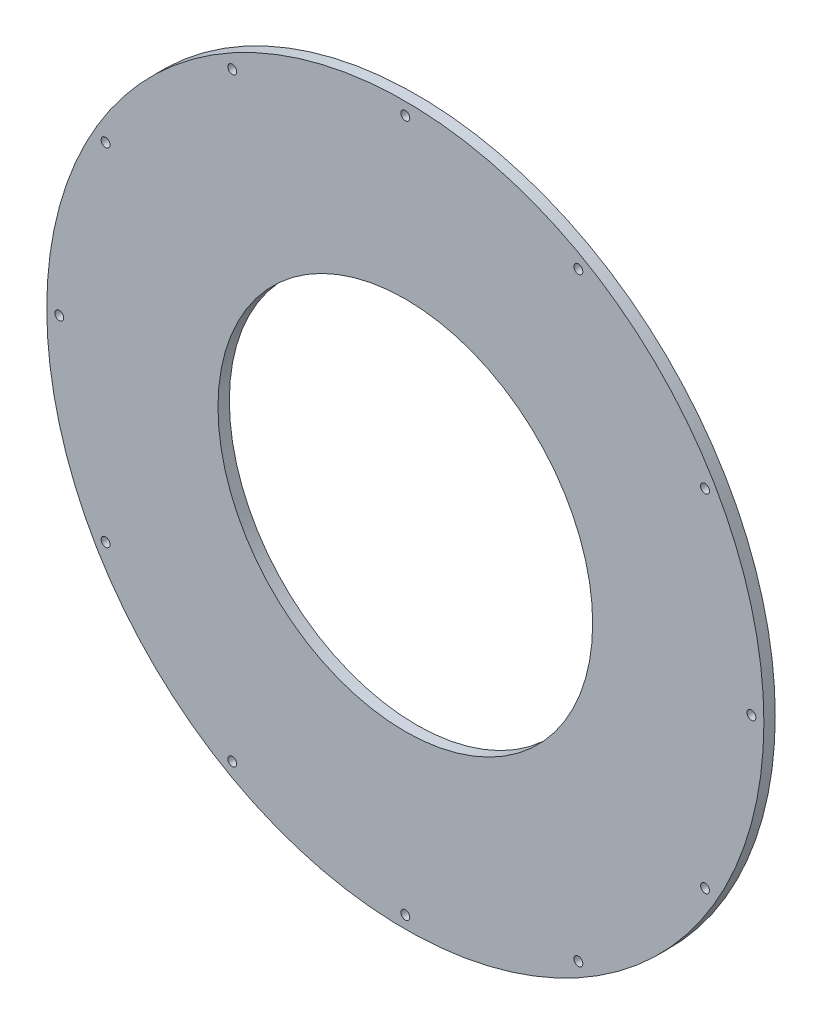
ISO-10303-21;
HEADER;
FILE_DESCRIPTION(('STEP AP214'),'2;1');
FILE_NAME('part.step','',(''),(''),'','','');
FILE_SCHEMA(('AUTOMOTIVE_DESIGN { 1 0 10303 214 1 1 1 1 }'));
ENDSEC;
DATA;
#1=APPLICATION_CONTEXT('core data for automotive mechanical design processes');
#2=APPLICATION_PROTOCOL_DEFINITION('international standard','automotive_design',2000,#1);
#3=PRODUCT_CONTEXT('',#1,'mechanical');
#4=PRODUCT('Part','Part','',(#3));
#5=PRODUCT_RELATED_PRODUCT_CATEGORY('part','',(#4));
#6=PRODUCT_DEFINITION_FORMATION('','',#4);
#7=PRODUCT_DEFINITION_CONTEXT('part definition',#1,'design');
#8=PRODUCT_DEFINITION('design','',#6,#7);
#9=PRODUCT_DEFINITION_SHAPE('','',#8);
#10=(LENGTH_UNIT() NAMED_UNIT(*) SI_UNIT(.MILLI.,.METRE.));
#11=(NAMED_UNIT(*) PLANE_ANGLE_UNIT() SI_UNIT($,.RADIAN.));
#12=(NAMED_UNIT(*) SI_UNIT($,.STERADIAN.) SOLID_ANGLE_UNIT());
#13=UNCERTAINTY_MEASURE_WITH_UNIT(LENGTH_MEASURE(1.E-05),#10,'distance_accuracy_value','');
#14=(GEOMETRIC_REPRESENTATION_CONTEXT(3) GLOBAL_UNCERTAINTY_ASSIGNED_CONTEXT((#13)) GLOBAL_UNIT_ASSIGNED_CONTEXT((#10,
#11,#12)) REPRESENTATION_CONTEXT('',''));
#15=CARTESIAN_POINT('',(0.,0.,0.));
#16=DIRECTION('',(0.,0.,1.));
#17=DIRECTION('',(1.,0.,0.));
#18=AXIS2_PLACEMENT_3D('',#15,#16,#17);
#19=CARTESIAN_POINT('',(0.,0.,6.35));
#20=DIRECTION('',(0.,0.,1.));
#21=DIRECTION('',(1.,0.,0.));
#22=AXIS2_PLACEMENT_3D('',#19,#20,#21);
#23=PLANE('',#22);
#24=CARTESIAN_POINT('',(-96.774,167.617484851671,6.35));
#25=DIRECTION('',(0.,0.,1.));
#26=DIRECTION('',(1.,0.,0.));
#27=AXIS2_PLACEMENT_3D('',#24,#25,#26);
#28=CIRCLE('',#27,2.48919999999998);
#29=CARTESIAN_POINT('',(-94.2848000000001,167.617484851671,6.35));
#30=VERTEX_POINT('',#29);
#31=EDGE_CURVE('E157',#30,#30,#28,.T.);
#32=ORIENTED_EDGE('',*,*,#31,.F.);
#33=EDGE_LOOP('',(#32));
#34=FACE_BOUND('',#33,.T.);
#35=CARTESIAN_POINT('',(-167.617484851671,96.774,6.35));
#36=DIRECTION('',(0.,0.,1.));
#37=DIRECTION('',(1.,0.,0.));
#38=AXIS2_PLACEMENT_3D('',#35,#36,#37);
#39=CIRCLE('',#38,2.4892);
#40=CARTESIAN_POINT('',(-165.128284851671,96.774,6.35));
#41=VERTEX_POINT('',#40);
#42=EDGE_CURVE('E149',#41,#41,#39,.T.);
#43=ORIENTED_EDGE('',*,*,#42,.F.);
#44=EDGE_LOOP('',(#43));
#45=FACE_BOUND('',#44,.T.);
#46=CARTESIAN_POINT('',(-193.548,0.,6.35));
#47=DIRECTION('',(0.,0.,1.));
#48=DIRECTION('',(1.,0.,0.));
#49=AXIS2_PLACEMENT_3D('',#46,#47,#48);
#50=CIRCLE('',#49,2.4892);
#51=CARTESIAN_POINT('',(-191.0588,0.,6.35));
#52=VERTEX_POINT('',#51);
#53=EDGE_CURVE('E141',#52,#52,#50,.T.);
#54=ORIENTED_EDGE('',*,*,#53,.F.);
#55=EDGE_LOOP('',(#54));
#56=FACE_BOUND('',#55,.T.);
#57=CARTESIAN_POINT('',(-167.617484851671,-96.774,6.35));
#58=DIRECTION('',(0.,0.,1.));
#59=DIRECTION('',(1.,0.,0.));
#60=AXIS2_PLACEMENT_3D('',#57,#58,#59);
#61=CIRCLE('',#60,2.4892);
#62=CARTESIAN_POINT('',(-165.128284851671,-96.774,6.35));
#63=VERTEX_POINT('',#62);
#64=EDGE_CURVE('E133',#63,#63,#61,.T.);
#65=ORIENTED_EDGE('',*,*,#64,.F.);
#66=EDGE_LOOP('',(#65));
#67=FACE_BOUND('',#66,.T.);
#68=CARTESIAN_POINT('',(-96.774,-167.617484851671,6.35));
#69=DIRECTION('',(0.,0.,1.));
#70=DIRECTION('',(1.,0.,0.));
#71=AXIS2_PLACEMENT_3D('',#68,#69,#70);
#72=CIRCLE('',#71,2.48919999999998);
#73=CARTESIAN_POINT('',(-94.2848,-167.617484851671,6.35));
#74=VERTEX_POINT('',#73);
#75=EDGE_CURVE('E125',#74,#74,#72,.T.);
#76=ORIENTED_EDGE('',*,*,#75,.F.);
#77=EDGE_LOOP('',(#76));
#78=FACE_BOUND('',#77,.T.);
#79=CARTESIAN_POINT('',(0.,-193.548,6.35));
#80=DIRECTION('',(0.,0.,1.));
#81=DIRECTION('',(1.,0.,0.));
#82=AXIS2_PLACEMENT_3D('',#79,#80,#81);
#83=CIRCLE('',#82,2.48919999999999);
#84=CARTESIAN_POINT('',(2.48919999999996,-193.548,6.35));
#85=VERTEX_POINT('',#84);
#86=EDGE_CURVE('E117',#85,#85,#83,.T.);
#87=ORIENTED_EDGE('',*,*,#86,.F.);
#88=EDGE_LOOP('',(#87));
#89=FACE_BOUND('',#88,.T.);
#90=CARTESIAN_POINT('',(96.7740000000001,-167.61748485167,6.35));
#91=DIRECTION('',(0.,0.,1.));
#92=DIRECTION('',(1.,0.,0.));
#93=AXIS2_PLACEMENT_3D('',#90,#91,#92);
#94=CIRCLE('',#93,2.48919999999998);
#95=CARTESIAN_POINT('',(99.2632000000001,-167.61748485167,6.35));
#96=VERTEX_POINT('',#95);
#97=EDGE_CURVE('E109',#96,#96,#94,.T.);
#98=ORIENTED_EDGE('',*,*,#97,.F.);
#99=EDGE_LOOP('',(#98));
#100=FACE_BOUND('',#99,.T.);
#101=CARTESIAN_POINT('',(167.617484851671,-96.774,6.35));
#102=DIRECTION('',(0.,0.,1.));
#103=DIRECTION('',(1.,0.,0.));
#104=AXIS2_PLACEMENT_3D('',#101,#102,#103);
#105=CIRCLE('',#104,2.4892);
#106=CARTESIAN_POINT('',(170.106684851671,-96.774,6.35));
#107=VERTEX_POINT('',#106);
#108=EDGE_CURVE('E101',#107,#107,#105,.T.);
#109=ORIENTED_EDGE('',*,*,#108,.F.);
#110=EDGE_LOOP('',(#109));
#111=FACE_BOUND('',#110,.T.);
#112=CARTESIAN_POINT('',(193.548,0.,6.35));
#113=DIRECTION('',(0.,0.,1.));
#114=DIRECTION('',(1.,0.,0.));
#115=AXIS2_PLACEMENT_3D('',#112,#113,#114);
#116=CIRCLE('',#115,2.4892);
#117=CARTESIAN_POINT('',(196.0372,0.,6.35));
#118=VERTEX_POINT('',#117);
#119=EDGE_CURVE('E93',#118,#118,#116,.T.);
#120=ORIENTED_EDGE('',*,*,#119,.F.);
#121=EDGE_LOOP('',(#120));
#122=FACE_BOUND('',#121,.T.);
#123=CARTESIAN_POINT('',(167.617484851671,96.7740000000001,6.35));
#124=DIRECTION('',(0.,0.,1.));
#125=DIRECTION('',(1.,0.,0.));
#126=AXIS2_PLACEMENT_3D('',#123,#124,#125);
#127=CIRCLE('',#126,2.4892);
#128=CARTESIAN_POINT('',(170.106684851671,96.7740000000001,6.35));
#129=VERTEX_POINT('',#128);
#130=EDGE_CURVE('E85',#129,#129,#127,.T.);
#131=ORIENTED_EDGE('',*,*,#130,.F.);
#132=EDGE_LOOP('',(#131));
#133=FACE_BOUND('',#132,.T.);
#134=CARTESIAN_POINT('',(96.774,167.617484851671,6.35));
#135=DIRECTION('',(0.,0.,1.));
#136=DIRECTION('',(1.,0.,0.));
#137=AXIS2_PLACEMENT_3D('',#134,#135,#136);
#138=CIRCLE('',#137,2.48919999999998);
#139=CARTESIAN_POINT('',(99.2632,167.617484851671,6.35));
#140=VERTEX_POINT('',#139);
#141=EDGE_CURVE('E77',#140,#140,#138,.T.);
#142=ORIENTED_EDGE('',*,*,#141,.F.);
#143=EDGE_LOOP('',(#142));
#144=FACE_BOUND('',#143,.T.);
#145=CARTESIAN_POINT('',(0.,193.548,6.35));
#146=DIRECTION('',(0.,0.,1.));
#147=DIRECTION('',(1.,0.,0.));
#148=AXIS2_PLACEMENT_3D('',#145,#146,#147);
#149=CIRCLE('',#148,2.48919999999999);
#150=CARTESIAN_POINT('',(2.48919999999993,193.548,6.35));
#151=VERTEX_POINT('',#150);
#152=EDGE_CURVE('E69',#151,#151,#149,.T.);
#153=ORIENTED_EDGE('',*,*,#152,.F.);
#154=EDGE_LOOP('',(#153));
#155=FACE_BOUND('',#154,.T.);
#156=CARTESIAN_POINT('',(0.,0.,6.35));
#157=DIRECTION('',(0.,0.,1.));
#158=DIRECTION('',(1.,0.,0.));
#159=AXIS2_PLACEMENT_3D('',#156,#157,#158);
#160=CIRCLE('',#159,200.533);
#161=CARTESIAN_POINT('',(200.533,0.,6.35));
#162=VERTEX_POINT('',#161);
#163=EDGE_CURVE('E10',#162,#162,#160,.T.);
#164=ORIENTED_EDGE('',*,*,#163,.T.);
#165=EDGE_LOOP('',(#164));
#166=FACE_BOUND('',#165,.T.);
#167=CARTESIAN_POINT('',(0.,0.,6.35));
#168=DIRECTION('',(0.,0.,1.));
#169=DIRECTION('',(1.,0.,0.));
#170=AXIS2_PLACEMENT_3D('',#167,#168,#169);
#171=CIRCLE('',#170,104.775);
#172=CARTESIAN_POINT('',(104.775,0.,6.35));
#173=VERTEX_POINT('',#172);
#174=EDGE_CURVE('E56',#173,#173,#171,.T.);
#175=ORIENTED_EDGE('',*,*,#174,.F.);
#176=EDGE_LOOP('',(#175));
#177=FACE_BOUND('',#176,.T.);
#178=ADVANCED_FACE('F43',(#34,#45,#56,#67,#78,#89,#100,#111,#122,#133,#144,#155,#166,#177),#23,.T.);
#179=CARTESIAN_POINT('',(0.,0.,0.));
#180=DIRECTION('',(0.,0.,1.));
#181=DIRECTION('',(1.,0.,0.));
#182=AXIS2_PLACEMENT_3D('',#179,#180,#181);
#183=PLANE('',#182);
#184=CARTESIAN_POINT('',(-96.774,167.617484851671,0.));
#185=DIRECTION('',(0.,0.,1.));
#186=DIRECTION('',(1.,0.,0.));
#187=AXIS2_PLACEMENT_3D('',#184,#185,#186);
#188=CIRCLE('',#187,2.48919999999998);
#189=CARTESIAN_POINT('',(-94.2848000000001,167.617484851671,0.));
#190=VERTEX_POINT('',#189);
#191=EDGE_CURVE('E153',#190,#190,#188,.T.);
#192=ORIENTED_EDGE('',*,*,#191,.T.);
#193=EDGE_LOOP('',(#192));
#194=FACE_BOUND('',#193,.T.);
#195=CARTESIAN_POINT('',(-167.617484851671,96.774,0.));
#196=DIRECTION('',(0.,0.,1.));
#197=DIRECTION('',(1.,0.,0.));
#198=AXIS2_PLACEMENT_3D('',#195,#196,#197);
#199=CIRCLE('',#198,2.4892);
#200=CARTESIAN_POINT('',(-165.128284851671,96.774,0.));
#201=VERTEX_POINT('',#200);
#202=EDGE_CURVE('E145',#201,#201,#199,.T.);
#203=ORIENTED_EDGE('',*,*,#202,.T.);
#204=EDGE_LOOP('',(#203));
#205=FACE_BOUND('',#204,.T.);
#206=CARTESIAN_POINT('',(-193.548,0.,0.));
#207=DIRECTION('',(0.,0.,1.));
#208=DIRECTION('',(1.,0.,0.));
#209=AXIS2_PLACEMENT_3D('',#206,#207,#208);
#210=CIRCLE('',#209,2.4892);
#211=CARTESIAN_POINT('',(-191.0588,0.,0.));
#212=VERTEX_POINT('',#211);
#213=EDGE_CURVE('E137',#212,#212,#210,.T.);
#214=ORIENTED_EDGE('',*,*,#213,.T.);
#215=EDGE_LOOP('',(#214));
#216=FACE_BOUND('',#215,.T.);
#217=CARTESIAN_POINT('',(-167.617484851671,-96.774,0.));
#218=DIRECTION('',(0.,0.,1.));
#219=DIRECTION('',(1.,0.,0.));
#220=AXIS2_PLACEMENT_3D('',#217,#218,#219);
#221=CIRCLE('',#220,2.4892);
#222=CARTESIAN_POINT('',(-165.128284851671,-96.774,0.));
#223=VERTEX_POINT('',#222);
#224=EDGE_CURVE('E129',#223,#223,#221,.T.);
#225=ORIENTED_EDGE('',*,*,#224,.T.);
#226=EDGE_LOOP('',(#225));
#227=FACE_BOUND('',#226,.T.);
#228=CARTESIAN_POINT('',(-96.774,-167.617484851671,0.));
#229=DIRECTION('',(0.,0.,1.));
#230=DIRECTION('',(1.,0.,0.));
#231=AXIS2_PLACEMENT_3D('',#228,#229,#230);
#232=CIRCLE('',#231,2.48919999999998);
#233=CARTESIAN_POINT('',(-94.2848,-167.617484851671,0.));
#234=VERTEX_POINT('',#233);
#235=EDGE_CURVE('E121',#234,#234,#232,.T.);
#236=ORIENTED_EDGE('',*,*,#235,.T.);
#237=EDGE_LOOP('',(#236));
#238=FACE_BOUND('',#237,.T.);
#239=CARTESIAN_POINT('',(0.,-193.548,0.));
#240=DIRECTION('',(0.,0.,1.));
#241=DIRECTION('',(1.,0.,0.));
#242=AXIS2_PLACEMENT_3D('',#239,#240,#241);
#243=CIRCLE('',#242,2.48919999999999);
#244=CARTESIAN_POINT('',(2.48919999999996,-193.548,0.));
#245=VERTEX_POINT('',#244);
#246=EDGE_CURVE('E113',#245,#245,#243,.T.);
#247=ORIENTED_EDGE('',*,*,#246,.T.);
#248=EDGE_LOOP('',(#247));
#249=FACE_BOUND('',#248,.T.);
#250=CARTESIAN_POINT('',(96.7740000000001,-167.61748485167,0.));
#251=DIRECTION('',(0.,0.,1.));
#252=DIRECTION('',(1.,0.,0.));
#253=AXIS2_PLACEMENT_3D('',#250,#251,#252);
#254=CIRCLE('',#253,2.48919999999998);
#255=CARTESIAN_POINT('',(99.2632000000001,-167.61748485167,0.));
#256=VERTEX_POINT('',#255);
#257=EDGE_CURVE('E105',#256,#256,#254,.T.);
#258=ORIENTED_EDGE('',*,*,#257,.T.);
#259=EDGE_LOOP('',(#258));
#260=FACE_BOUND('',#259,.T.);
#261=CARTESIAN_POINT('',(167.617484851671,-96.774,0.));
#262=DIRECTION('',(0.,0.,1.));
#263=DIRECTION('',(1.,0.,0.));
#264=AXIS2_PLACEMENT_3D('',#261,#262,#263);
#265=CIRCLE('',#264,2.4892);
#266=CARTESIAN_POINT('',(170.106684851671,-96.774,0.));
#267=VERTEX_POINT('',#266);
#268=EDGE_CURVE('E97',#267,#267,#265,.T.);
#269=ORIENTED_EDGE('',*,*,#268,.T.);
#270=EDGE_LOOP('',(#269));
#271=FACE_BOUND('',#270,.T.);
#272=CARTESIAN_POINT('',(193.548,0.,0.));
#273=DIRECTION('',(0.,0.,1.));
#274=DIRECTION('',(1.,0.,0.));
#275=AXIS2_PLACEMENT_3D('',#272,#273,#274);
#276=CIRCLE('',#275,2.4892);
#277=CARTESIAN_POINT('',(196.0372,0.,0.));
#278=VERTEX_POINT('',#277);
#279=EDGE_CURVE('E89',#278,#278,#276,.T.);
#280=ORIENTED_EDGE('',*,*,#279,.T.);
#281=EDGE_LOOP('',(#280));
#282=FACE_BOUND('',#281,.T.);
#283=CARTESIAN_POINT('',(167.617484851671,96.7740000000001,0.));
#284=DIRECTION('',(0.,0.,1.));
#285=DIRECTION('',(1.,0.,0.));
#286=AXIS2_PLACEMENT_3D('',#283,#284,#285);
#287=CIRCLE('',#286,2.4892);
#288=CARTESIAN_POINT('',(170.106684851671,96.7740000000001,0.));
#289=VERTEX_POINT('',#288);
#290=EDGE_CURVE('E81',#289,#289,#287,.T.);
#291=ORIENTED_EDGE('',*,*,#290,.T.);
#292=EDGE_LOOP('',(#291));
#293=FACE_BOUND('',#292,.T.);
#294=CARTESIAN_POINT('',(96.774,167.617484851671,0.));
#295=DIRECTION('',(0.,0.,1.));
#296=DIRECTION('',(1.,0.,0.));
#297=AXIS2_PLACEMENT_3D('',#294,#295,#296);
#298=CIRCLE('',#297,2.48919999999998);
#299=CARTESIAN_POINT('',(99.2632,167.617484851671,0.));
#300=VERTEX_POINT('',#299);
#301=EDGE_CURVE('E73',#300,#300,#298,.T.);
#302=ORIENTED_EDGE('',*,*,#301,.T.);
#303=EDGE_LOOP('',(#302));
#304=FACE_BOUND('',#303,.T.);
#305=CARTESIAN_POINT('',(0.,193.548,0.));
#306=DIRECTION('',(0.,0.,1.));
#307=DIRECTION('',(1.,0.,0.));
#308=AXIS2_PLACEMENT_3D('',#305,#306,#307);
#309=CIRCLE('',#308,2.48919999999999);
#310=CARTESIAN_POINT('',(2.48919999999993,193.548,0.));
#311=VERTEX_POINT('',#310);
#312=EDGE_CURVE('E62',#311,#311,#309,.T.);
#313=ORIENTED_EDGE('',*,*,#312,.T.);
#314=EDGE_LOOP('',(#313));
#315=FACE_BOUND('',#314,.T.);
#316=CARTESIAN_POINT('',(0.,0.,0.));
#317=DIRECTION('',(0.,0.,1.));
#318=DIRECTION('',(1.,0.,0.));
#319=AXIS2_PLACEMENT_3D('',#316,#317,#318);
#320=CIRCLE('',#319,200.533);
#321=CARTESIAN_POINT('',(200.533,0.,0.));
#322=VERTEX_POINT('',#321);
#323=EDGE_CURVE('E47',#322,#322,#320,.T.);
#324=ORIENTED_EDGE('',*,*,#323,.F.);
#325=EDGE_LOOP('',(#324));
#326=FACE_BOUND('',#325,.T.);
#327=CARTESIAN_POINT('',(0.,0.,0.));
#328=DIRECTION('',(0.,0.,1.));
#329=DIRECTION('',(1.,0.,0.));
#330=AXIS2_PLACEMENT_3D('',#327,#328,#329);
#331=CIRCLE('',#330,104.775);
#332=CARTESIAN_POINT('',(104.775,0.,0.));
#333=VERTEX_POINT('',#332);
#334=EDGE_CURVE('E58',#333,#333,#331,.T.);
#335=ORIENTED_EDGE('',*,*,#334,.T.);
#336=EDGE_LOOP('',(#335));
#337=FACE_BOUND('',#336,.T.);
#338=ADVANCED_FACE('F166',(#194,#205,#216,#227,#238,#249,#260,#271,#282,#293,#304,#315,#326,
#337),#183,.F.);
#339=CARTESIAN_POINT('',(0.,0.,6.35));
#340=DIRECTION('',(0.,0.,-1.));
#341=DIRECTION('',(-1.,0.,0.));
#342=AXIS2_PLACEMENT_3D('',#339,#340,#341);
#343=CYLINDRICAL_SURFACE('',#342,200.533);
#344=ORIENTED_EDGE('',*,*,#163,.F.);
#345=EDGE_LOOP('',(#344));
#346=FACE_BOUND('',#345,.T.);
#347=ORIENTED_EDGE('',*,*,#323,.T.);
#348=EDGE_LOOP('',(#347));
#349=FACE_BOUND('',#348,.T.);
#350=ADVANCED_FACE('F45',(#346,#349),#343,.T.);
#351=CARTESIAN_POINT('',(0.,0.,6.35));
#352=DIRECTION('',(0.,0.,-1.));
#353=DIRECTION('',(-1.,0.,0.));
#354=AXIS2_PLACEMENT_3D('',#351,#352,#353);
#355=CYLINDRICAL_SURFACE('',#354,104.775);
#356=ORIENTED_EDGE('',*,*,#174,.T.);
#357=EDGE_LOOP('',(#356));
#358=FACE_BOUND('',#357,.T.);
#359=ORIENTED_EDGE('',*,*,#334,.F.);
#360=EDGE_LOOP('',(#359));
#361=FACE_BOUND('',#360,.T.);
#362=ADVANCED_FACE('F192',(#358,#361),#355,.F.);
#363=CARTESIAN_POINT('',(0.,193.548,6.35));
#364=DIRECTION('',(0.,0.,1.));
#365=DIRECTION('',(1.,0.,0.));
#366=AXIS2_PLACEMENT_3D('',#363,#364,#365);
#367=CYLINDRICAL_SURFACE('',#366,2.48919999999999);
#368=ORIENTED_EDGE('',*,*,#312,.F.);
#369=EDGE_LOOP('',(#368));
#370=FACE_BOUND('',#369,.T.);
#371=ORIENTED_EDGE('',*,*,#152,.T.);
#372=EDGE_LOOP('',(#371));
#373=FACE_BOUND('',#372,.T.);
#374=ADVANCED_FACE('F195',(#370,#373),#367,.F.);
#375=CARTESIAN_POINT('',(96.774,167.617484851671,6.35));
#376=DIRECTION('',(0.,0.,1.));
#377=DIRECTION('',(1.,0.,0.));
#378=AXIS2_PLACEMENT_3D('',#375,#376,#377);
#379=CYLINDRICAL_SURFACE('',#378,2.48919999999998);
#380=ORIENTED_EDGE('',*,*,#301,.F.);
#381=EDGE_LOOP('',(#380));
#382=FACE_BOUND('',#381,.T.);
#383=ORIENTED_EDGE('',*,*,#141,.T.);
#384=EDGE_LOOP('',(#383));
#385=FACE_BOUND('',#384,.T.);
#386=ADVANCED_FACE('F209',(#382,#385),#379,.F.);
#387=CARTESIAN_POINT('',(167.617484851671,96.7740000000001,6.35));
#388=DIRECTION('',(0.,0.,1.));
#389=DIRECTION('',(1.,0.,0.));
#390=AXIS2_PLACEMENT_3D('',#387,#388,#389);
#391=CYLINDRICAL_SURFACE('',#390,2.4892);
#392=ORIENTED_EDGE('',*,*,#290,.F.);
#393=EDGE_LOOP('',(#392));
#394=FACE_BOUND('',#393,.T.);
#395=ORIENTED_EDGE('',*,*,#130,.T.);
#396=EDGE_LOOP('',(#395));
#397=FACE_BOUND('',#396,.T.);
#398=ADVANCED_FACE('F213',(#394,#397),#391,.F.);
#399=CARTESIAN_POINT('',(193.548,0.,6.35));
#400=DIRECTION('',(0.,0.,1.));
#401=DIRECTION('',(1.,0.,0.));
#402=AXIS2_PLACEMENT_3D('',#399,#400,#401);
#403=CYLINDRICAL_SURFACE('',#402,2.4892);
#404=ORIENTED_EDGE('',*,*,#279,.F.);
#405=EDGE_LOOP('',(#404));
#406=FACE_BOUND('',#405,.T.);
#407=ORIENTED_EDGE('',*,*,#119,.T.);
#408=EDGE_LOOP('',(#407));
#409=FACE_BOUND('',#408,.T.);
#410=ADVANCED_FACE('F217',(#406,#409),#403,.F.);
#411=CARTESIAN_POINT('',(167.617484851671,-96.774,6.35));
#412=DIRECTION('',(0.,0.,1.));
#413=DIRECTION('',(1.,0.,0.));
#414=AXIS2_PLACEMENT_3D('',#411,#412,#413);
#415=CYLINDRICAL_SURFACE('',#414,2.4892);
#416=ORIENTED_EDGE('',*,*,#268,.F.);
#417=EDGE_LOOP('',(#416));
#418=FACE_BOUND('',#417,.T.);
#419=ORIENTED_EDGE('',*,*,#108,.T.);
#420=EDGE_LOOP('',(#419));
#421=FACE_BOUND('',#420,.T.);
#422=ADVANCED_FACE('F221',(#418,#421),#415,.F.);
#423=CARTESIAN_POINT('',(96.7740000000001,-167.61748485167,6.35));
#424=DIRECTION('',(0.,0.,1.));
#425=DIRECTION('',(1.,0.,0.));
#426=AXIS2_PLACEMENT_3D('',#423,#424,#425);
#427=CYLINDRICAL_SURFACE('',#426,2.48919999999998);
#428=ORIENTED_EDGE('',*,*,#257,.F.);
#429=EDGE_LOOP('',(#428));
#430=FACE_BOUND('',#429,.T.);
#431=ORIENTED_EDGE('',*,*,#97,.T.);
#432=EDGE_LOOP('',(#431));
#433=FACE_BOUND('',#432,.T.);
#434=ADVANCED_FACE('F225',(#430,#433),#427,.F.);
#435=CARTESIAN_POINT('',(0.,-193.548,6.35));
#436=DIRECTION('',(0.,0.,1.));
#437=DIRECTION('',(1.,0.,0.));
#438=AXIS2_PLACEMENT_3D('',#435,#436,#437);
#439=CYLINDRICAL_SURFACE('',#438,2.48919999999999);
#440=ORIENTED_EDGE('',*,*,#246,.F.);
#441=EDGE_LOOP('',(#440));
#442=FACE_BOUND('',#441,.T.);
#443=ORIENTED_EDGE('',*,*,#86,.T.);
#444=EDGE_LOOP('',(#443));
#445=FACE_BOUND('',#444,.T.);
#446=ADVANCED_FACE('F229',(#442,#445),#439,.F.);
#447=CARTESIAN_POINT('',(-96.774,-167.617484851671,6.35));
#448=DIRECTION('',(0.,0.,1.));
#449=DIRECTION('',(1.,0.,0.));
#450=AXIS2_PLACEMENT_3D('',#447,#448,#449);
#451=CYLINDRICAL_SURFACE('',#450,2.48919999999998);
#452=ORIENTED_EDGE('',*,*,#235,.F.);
#453=EDGE_LOOP('',(#452));
#454=FACE_BOUND('',#453,.T.);
#455=ORIENTED_EDGE('',*,*,#75,.T.);
#456=EDGE_LOOP('',(#455));
#457=FACE_BOUND('',#456,.T.);
#458=ADVANCED_FACE('F233',(#454,#457),#451,.F.);
#459=CARTESIAN_POINT('',(-167.617484851671,-96.774,6.35));
#460=DIRECTION('',(0.,0.,1.));
#461=DIRECTION('',(1.,0.,0.));
#462=AXIS2_PLACEMENT_3D('',#459,#460,#461);
#463=CYLINDRICAL_SURFACE('',#462,2.4892);
#464=ORIENTED_EDGE('',*,*,#224,.F.);
#465=EDGE_LOOP('',(#464));
#466=FACE_BOUND('',#465,.T.);
#467=ORIENTED_EDGE('',*,*,#64,.T.);
#468=EDGE_LOOP('',(#467));
#469=FACE_BOUND('',#468,.T.);
#470=ADVANCED_FACE('F237',(#466,#469),#463,.F.);
#471=CARTESIAN_POINT('',(-193.548,0.,6.35));
#472=DIRECTION('',(0.,0.,1.));
#473=DIRECTION('',(1.,0.,0.));
#474=AXIS2_PLACEMENT_3D('',#471,#472,#473);
#475=CYLINDRICAL_SURFACE('',#474,2.4892);
#476=ORIENTED_EDGE('',*,*,#213,.F.);
#477=EDGE_LOOP('',(#476));
#478=FACE_BOUND('',#477,.T.);
#479=ORIENTED_EDGE('',*,*,#53,.T.);
#480=EDGE_LOOP('',(#479));
#481=FACE_BOUND('',#480,.T.);
#482=ADVANCED_FACE('F241',(#478,#481),#475,.F.);
#483=CARTESIAN_POINT('',(-167.617484851671,96.774,6.35));
#484=DIRECTION('',(0.,0.,1.));
#485=DIRECTION('',(1.,0.,0.));
#486=AXIS2_PLACEMENT_3D('',#483,#484,#485);
#487=CYLINDRICAL_SURFACE('',#486,2.4892);
#488=ORIENTED_EDGE('',*,*,#202,.F.);
#489=EDGE_LOOP('',(#488));
#490=FACE_BOUND('',#489,.T.);
#491=ORIENTED_EDGE('',*,*,#42,.T.);
#492=EDGE_LOOP('',(#491));
#493=FACE_BOUND('',#492,.T.);
#494=ADVANCED_FACE('F245',(#490,#493),#487,.F.);
#495=CARTESIAN_POINT('',(-96.774,167.617484851671,6.35));
#496=DIRECTION('',(0.,0.,1.));
#497=DIRECTION('',(1.,0.,0.));
#498=AXIS2_PLACEMENT_3D('',#495,#496,#497);
#499=CYLINDRICAL_SURFACE('',#498,2.48919999999998);
#500=ORIENTED_EDGE('',*,*,#191,.F.);
#501=EDGE_LOOP('',(#500));
#502=FACE_BOUND('',#501,.T.);
#503=ORIENTED_EDGE('',*,*,#31,.T.);
#504=EDGE_LOOP('',(#503));
#505=FACE_BOUND('',#504,.T.);
#506=ADVANCED_FACE('F162',(#502,#505),#499,.F.);
#507=CLOSED_SHELL('',(#178,#338,#350,#362,#374,#386,#398,#410,#422,#434,#446,#458,#470,#482,
#494,#506));
#508=MANIFOLD_SOLID_BREP('B2',#507);
#509=ADVANCED_BREP_SHAPE_REPRESENTATION('',(#18,#508),#14);
#510=SHAPE_DEFINITION_REPRESENTATION(#9,#509);
ENDSEC;
END-ISO-10303-21;
